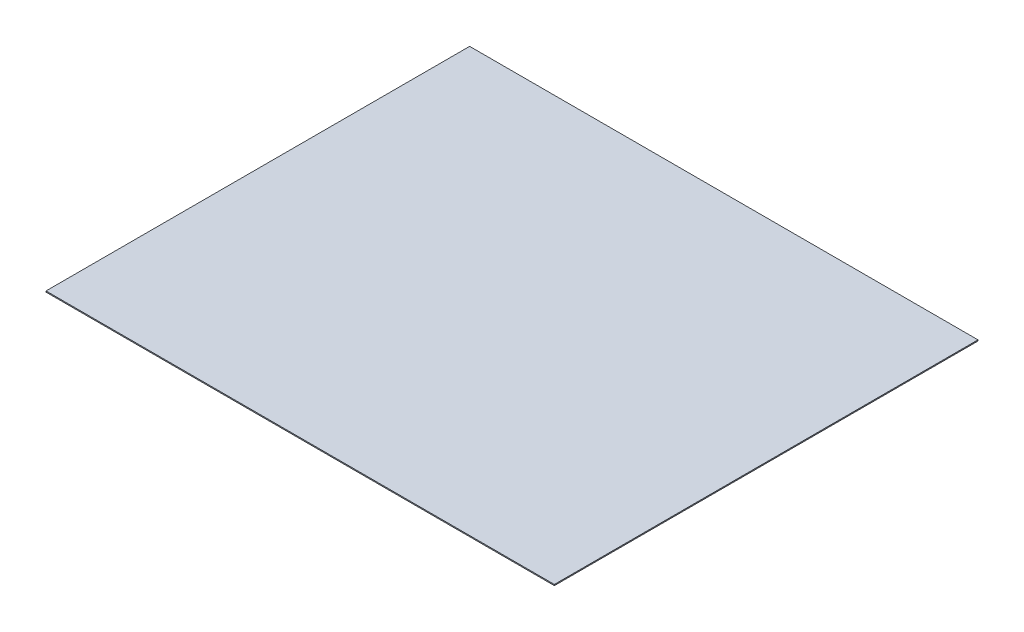
ISO-10303-21;
HEADER;
FILE_DESCRIPTION(('STEP AP214'),'2;1');
FILE_NAME('part.step','',(''),(''),'','','');
FILE_SCHEMA(('AUTOMOTIVE_DESIGN { 1 0 10303 214 1 1 1 1 }'));
ENDSEC;
DATA;
#1=APPLICATION_CONTEXT('core data for automotive mechanical design processes');
#2=APPLICATION_PROTOCOL_DEFINITION('international standard','automotive_design',2000,#1);
#3=PRODUCT_CONTEXT('',#1,'mechanical');
#4=PRODUCT('Part','Part','',(#3));
#5=PRODUCT_RELATED_PRODUCT_CATEGORY('part','',(#4));
#6=PRODUCT_DEFINITION_FORMATION('','',#4);
#7=PRODUCT_DEFINITION_CONTEXT('part definition',#1,'design');
#8=PRODUCT_DEFINITION('design','',#6,#7);
#9=PRODUCT_DEFINITION_SHAPE('','',#8);
#10=(LENGTH_UNIT() NAMED_UNIT(*) SI_UNIT(.MILLI.,.METRE.));
#11=(NAMED_UNIT(*) PLANE_ANGLE_UNIT() SI_UNIT($,.RADIAN.));
#12=(NAMED_UNIT(*) SI_UNIT($,.STERADIAN.) SOLID_ANGLE_UNIT());
#13=UNCERTAINTY_MEASURE_WITH_UNIT(LENGTH_MEASURE(1.E-05),#10,'distance_accuracy_value','');
#14=(GEOMETRIC_REPRESENTATION_CONTEXT(3) GLOBAL_UNCERTAINTY_ASSIGNED_CONTEXT((#13)) GLOBAL_UNIT_ASSIGNED_CONTEXT((#10,
#11,#12)) REPRESENTATION_CONTEXT('',''));
#15=CARTESIAN_POINT('',(0.,0.,0.));
#16=DIRECTION('',(0.,0.,1.));
#17=DIRECTION('',(1.,0.,0.));
#18=AXIS2_PLACEMENT_3D('',#15,#16,#17);
#19=CARTESIAN_POINT('',(-1200.,5.,1000.));
#20=DIRECTION('',(1.,0.,0.));
#21=DIRECTION('',(0.,0.,-1.));
#22=AXIS2_PLACEMENT_3D('',#19,#20,#21);
#23=PLANE('',#22);
#24=DIRECTION('',(0.,0.,1.));
#25=VECTOR('',#24,1.);
#26=CARTESIAN_POINT('',(-1200.,0.,1000.));
#27=LINE('',#26,#25);
#28=CARTESIAN_POINT('',(-1200.,0.,-1000.));
#29=VERTEX_POINT('',#28);
#30=CARTESIAN_POINT('',(-1200.,0.,1000.));
#31=VERTEX_POINT('',#30);
#32=EDGE_CURVE('E96',#29,#31,#27,.T.);
#33=ORIENTED_EDGE('',*,*,#32,.T.);
#34=DIRECTION('',(0.,-1.,0.));
#35=VECTOR('',#34,1.);
#36=CARTESIAN_POINT('',(-1200.,5.,1000.));
#37=LINE('',#36,#35);
#38=CARTESIAN_POINT('',(-1200.,5.,1000.));
#39=VERTEX_POINT('',#38);
#40=EDGE_CURVE('E11',#39,#31,#37,.T.);
#41=ORIENTED_EDGE('',*,*,#40,.F.);
#42=DIRECTION('',(0.,0.,1.));
#43=VECTOR('',#42,1.);
#44=CARTESIAN_POINT('',(-1200.,5.,1000.));
#45=LINE('',#44,#43);
#46=CARTESIAN_POINT('',(-1200.,5.,-1000.));
#47=VERTEX_POINT('',#46);
#48=EDGE_CURVE('E84',#47,#39,#45,.T.);
#49=ORIENTED_EDGE('',*,*,#48,.F.);
#50=DIRECTION('',(0.,-1.,0.));
#51=VECTOR('',#50,1.);
#52=CARTESIAN_POINT('',(-1200.,5.,-1000.));
#53=LINE('',#52,#51);
#54=EDGE_CURVE('E92',#47,#29,#53,.T.);
#55=ORIENTED_EDGE('',*,*,#54,.T.);
#56=EDGE_LOOP('',(#33,#41,#49,#55));
#57=FACE_BOUND('',#56,.T.);
#58=ADVANCED_FACE('F33',(#57),#23,.F.);
#59=CARTESIAN_POINT('',(1200.,5.,1000.));
#60=DIRECTION('',(0.,0.,-1.));
#61=DIRECTION('',(-1.,0.,0.));
#62=AXIS2_PLACEMENT_3D('',#59,#60,#61);
#63=PLANE('',#62);
#64=DIRECTION('',(1.,0.,0.));
#65=VECTOR('',#64,1.);
#66=CARTESIAN_POINT('',(1200.,0.,1000.));
#67=LINE('',#66,#65);
#68=CARTESIAN_POINT('',(1200.,0.,1000.));
#69=VERTEX_POINT('',#68);
#70=EDGE_CURVE('E88',#31,#69,#67,.T.);
#71=ORIENTED_EDGE('',*,*,#70,.T.);
#72=DIRECTION('',(0.,-1.,0.));
#73=VECTOR('',#72,1.);
#74=CARTESIAN_POINT('',(1200.,5.,1000.));
#75=LINE('',#74,#73);
#76=CARTESIAN_POINT('',(1200.,5.,1000.));
#77=VERTEX_POINT('',#76);
#78=EDGE_CURVE('E41',#77,#69,#75,.T.);
#79=ORIENTED_EDGE('',*,*,#78,.F.);
#80=DIRECTION('',(1.,0.,0.));
#81=VECTOR('',#80,1.);
#82=CARTESIAN_POINT('',(1200.,5.,1000.));
#83=LINE('',#82,#81);
#84=EDGE_CURVE('E79',#39,#77,#83,.T.);
#85=ORIENTED_EDGE('',*,*,#84,.F.);
#86=ORIENTED_EDGE('',*,*,#40,.T.);
#87=EDGE_LOOP('',(#71,#79,#85,#86));
#88=FACE_BOUND('',#87,.T.);
#89=ADVANCED_FACE('F87',(#88),#63,.F.);
#90=CARTESIAN_POINT('',(1200.,5.,1000.));
#91=DIRECTION('',(-1.,0.,0.));
#92=DIRECTION('',(0.,0.,1.));
#93=AXIS2_PLACEMENT_3D('',#90,#91,#92);
#94=PLANE('',#93);
#95=DIRECTION('',(0.,0.,-1.));
#96=VECTOR('',#95,1.);
#97=CARTESIAN_POINT('',(1200.,0.,1000.));
#98=LINE('',#97,#96);
#99=CARTESIAN_POINT('',(1200.,0.,-1000.));
#100=VERTEX_POINT('',#99);
#101=EDGE_CURVE('E66',#69,#100,#98,.T.);
#102=ORIENTED_EDGE('',*,*,#101,.T.);
#103=DIRECTION('',(0.,-1.,0.));
#104=VECTOR('',#103,1.);
#105=CARTESIAN_POINT('',(1200.,5.,-1000.));
#106=LINE('',#105,#104);
#107=CARTESIAN_POINT('',(1200.,5.,-1000.));
#108=VERTEX_POINT('',#107);
#109=EDGE_CURVE('E89',#108,#100,#106,.T.);
#110=ORIENTED_EDGE('',*,*,#109,.F.);
#111=DIRECTION('',(0.,0.,-1.));
#112=VECTOR('',#111,1.);
#113=CARTESIAN_POINT('',(1200.,5.,1000.));
#114=LINE('',#113,#112);
#115=EDGE_CURVE('E82',#77,#108,#114,.T.);
#116=ORIENTED_EDGE('',*,*,#115,.F.);
#117=ORIENTED_EDGE('',*,*,#78,.T.);
#118=EDGE_LOOP('',(#102,#110,#116,#117));
#119=FACE_BOUND('',#118,.T.);
#120=ADVANCED_FACE('F90',(#119),#94,.F.);
#121=CARTESIAN_POINT('',(1200.,5.,-1000.));
#122=DIRECTION('',(0.,0.,1.));
#123=DIRECTION('',(1.,0.,0.));
#124=AXIS2_PLACEMENT_3D('',#121,#122,#123);
#125=PLANE('',#124);
#126=DIRECTION('',(-1.,0.,0.));
#127=VECTOR('',#126,1.);
#128=CARTESIAN_POINT('',(1200.,0.,-1000.));
#129=LINE('',#128,#127);
#130=EDGE_CURVE('E72',#100,#29,#129,.T.);
#131=ORIENTED_EDGE('',*,*,#130,.T.);
#132=ORIENTED_EDGE('',*,*,#54,.F.);
#133=DIRECTION('',(-1.,0.,0.));
#134=VECTOR('',#133,1.);
#135=CARTESIAN_POINT('',(1200.,5.,-1000.));
#136=LINE('',#135,#134);
#137=EDGE_CURVE('E49',#108,#47,#136,.T.);
#138=ORIENTED_EDGE('',*,*,#137,.F.);
#139=ORIENTED_EDGE('',*,*,#109,.T.);
#140=EDGE_LOOP('',(#131,#132,#138,#139));
#141=FACE_BOUND('',#140,.T.);
#142=ADVANCED_FACE('F103',(#141),#125,.F.);
#143=CARTESIAN_POINT('',(0.,5.,0.));
#144=DIRECTION('',(0.,1.,0.));
#145=DIRECTION('',(0.,0.,1.));
#146=AXIS2_PLACEMENT_3D('',#143,#144,#145);
#147=PLANE('',#146);
#148=ORIENTED_EDGE('',*,*,#48,.T.);
#149=ORIENTED_EDGE('',*,*,#84,.T.);
#150=ORIENTED_EDGE('',*,*,#115,.T.);
#151=ORIENTED_EDGE('',*,*,#137,.T.);
#152=EDGE_LOOP('',(#148,#149,#150,#151));
#153=FACE_BOUND('',#152,.T.);
#154=ADVANCED_FACE('F80',(#153),#147,.T.);
#155=CARTESIAN_POINT('',(0.,0.,0.));
#156=DIRECTION('',(0.,1.,0.));
#157=DIRECTION('',(0.,0.,1.));
#158=AXIS2_PLACEMENT_3D('',#155,#156,#157);
#159=PLANE('',#158);
#160=ORIENTED_EDGE('',*,*,#32,.F.);
#161=ORIENTED_EDGE('',*,*,#130,.F.);
#162=ORIENTED_EDGE('',*,*,#101,.F.);
#163=ORIENTED_EDGE('',*,*,#70,.F.);
#164=EDGE_LOOP('',(#160,#161,#162,#163));
#165=FACE_BOUND('',#164,.T.);
#166=ADVANCED_FACE('F106',(#165),#159,.F.);
#167=CLOSED_SHELL('',(#58,#89,#120,#142,#154,#166));
#168=MANIFOLD_SOLID_BREP('B2',#167);
#169=ADVANCED_BREP_SHAPE_REPRESENTATION('',(#18,#168),#14);
#170=SHAPE_DEFINITION_REPRESENTATION(#9,#169);
ENDSEC;
END-ISO-10303-21;
